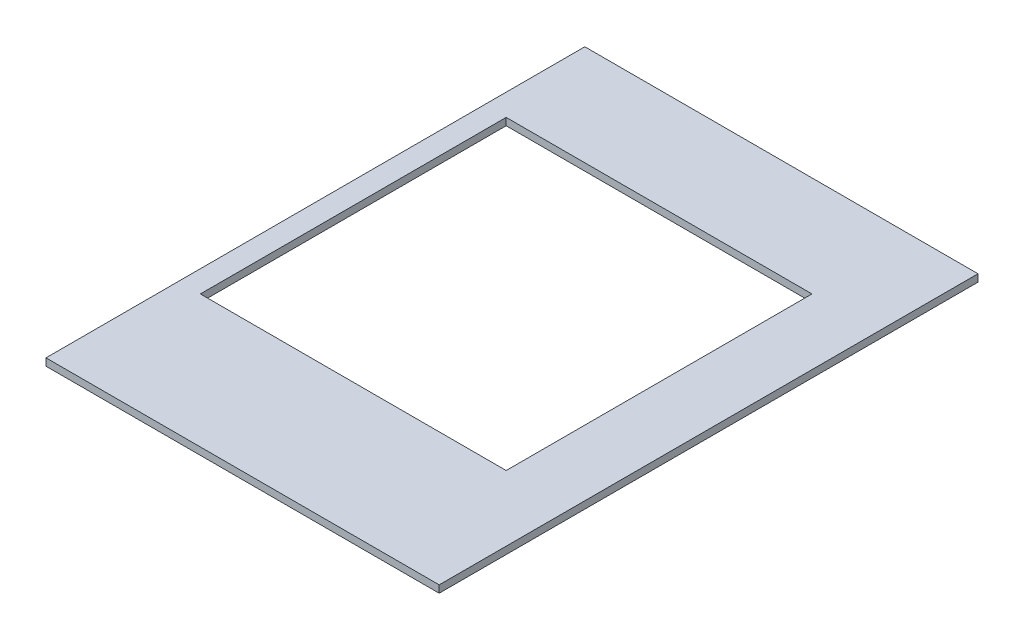
ISO-10303-21;
HEADER;
FILE_DESCRIPTION(('STEP AP214'),'2;1');
FILE_NAME('part.step','',(''),(''),'','','');
FILE_SCHEMA(('AUTOMOTIVE_DESIGN { 1 0 10303 214 1 1 1 1 }'));
ENDSEC;
DATA;
#1=APPLICATION_CONTEXT('core data for automotive mechanical design processes');
#2=APPLICATION_PROTOCOL_DEFINITION('international standard','automotive_design',2000,#1);
#3=PRODUCT_CONTEXT('',#1,'mechanical');
#4=PRODUCT('Part','Part','',(#3));
#5=PRODUCT_RELATED_PRODUCT_CATEGORY('part','',(#4));
#6=PRODUCT_DEFINITION_FORMATION('','',#4);
#7=PRODUCT_DEFINITION_CONTEXT('part definition',#1,'design');
#8=PRODUCT_DEFINITION('design','',#6,#7);
#9=PRODUCT_DEFINITION_SHAPE('','',#8);
#10=(LENGTH_UNIT() NAMED_UNIT(*) SI_UNIT(.MILLI.,.METRE.));
#11=(NAMED_UNIT(*) PLANE_ANGLE_UNIT() SI_UNIT($,.RADIAN.));
#12=(NAMED_UNIT(*) SI_UNIT($,.STERADIAN.) SOLID_ANGLE_UNIT());
#13=UNCERTAINTY_MEASURE_WITH_UNIT(LENGTH_MEASURE(1.E-05),#10,'distance_accuracy_value','');
#14=(GEOMETRIC_REPRESENTATION_CONTEXT(3) GLOBAL_UNCERTAINTY_ASSIGNED_CONTEXT((#13)) GLOBAL_UNIT_ASSIGNED_CONTEXT((#10,
#11,#12)) REPRESENTATION_CONTEXT('',''));
#15=CARTESIAN_POINT('',(0.,0.,0.));
#16=DIRECTION('',(0.,0.,1.));
#17=DIRECTION('',(1.,0.,0.));
#18=AXIS2_PLACEMENT_3D('',#15,#16,#17);
#19=CARTESIAN_POINT('',(0.,5.,0.));
#20=DIRECTION('',(0.,-1.,0.));
#21=DIRECTION('',(0.,0.,-1.));
#22=AXIS2_PLACEMENT_3D('',#19,#20,#21);
#23=PLANE('',#22);
#24=DIRECTION('',(0.,0.,1.));
#25=VECTOR('',#24,1.);
#26=CARTESIAN_POINT('',(0.,5.,0.));
#27=LINE('',#26,#25);
#28=CARTESIAN_POINT('',(0.,5.,-370.));
#29=VERTEX_POINT('',#28);
#30=CARTESIAN_POINT('',(0.,5.,0.));
#31=VERTEX_POINT('',#30);
#32=EDGE_CURVE('E134',#29,#31,#27,.T.);
#33=ORIENTED_EDGE('',*,*,#32,.T.);
#34=DIRECTION('',(1.,0.,0.));
#35=VECTOR('',#34,1.);
#36=CARTESIAN_POINT('',(0.,5.,0.));
#37=LINE('',#36,#35);
#38=CARTESIAN_POINT('',(270.,5.,0.));
#39=VERTEX_POINT('',#38);
#40=EDGE_CURVE('E137',#31,#39,#37,.T.);
#41=ORIENTED_EDGE('',*,*,#40,.T.);
#42=DIRECTION('',(0.,0.,-1.));
#43=VECTOR('',#42,1.);
#44=CARTESIAN_POINT('',(270.,5.,0.));
#45=LINE('',#44,#43);
#46=CARTESIAN_POINT('',(270.,5.,-370.));
#47=VERTEX_POINT('',#46);
#48=EDGE_CURVE('E140',#39,#47,#45,.T.);
#49=ORIENTED_EDGE('',*,*,#48,.T.);
#50=DIRECTION('',(-1.,0.,0.));
#51=VECTOR('',#50,1.);
#52=CARTESIAN_POINT('',(0.,5.,-370.));
#53=LINE('',#52,#51);
#54=EDGE_CURVE('E142',#47,#29,#53,.T.);
#55=ORIENTED_EDGE('',*,*,#54,.T.);
#56=EDGE_LOOP('',(#33,#41,#49,#55));
#57=FACE_BOUND('',#56,.T.);
#58=DIRECTION('',(0.,0.,1.));
#59=VECTOR('',#58,1.);
#60=CARTESIAN_POINT('',(15.,5.,-91.));
#61=LINE('',#60,#59);
#62=CARTESIAN_POINT('',(15.,5.,-301.));
#63=VERTEX_POINT('',#62);
#64=CARTESIAN_POINT('',(15.,5.,-91.));
#65=VERTEX_POINT('',#64);
#66=EDGE_CURVE('E98',#63,#65,#61,.T.);
#67=ORIENTED_EDGE('',*,*,#66,.F.);
#68=DIRECTION('',(-1.,0.,0.));
#69=VECTOR('',#68,1.);
#70=CARTESIAN_POINT('',(15.,5.,-301.));
#71=LINE('',#70,#69);
#72=CARTESIAN_POINT('',(225.,5.,-301.));
#73=VERTEX_POINT('',#72);
#74=EDGE_CURVE('E120',#73,#63,#71,.T.);
#75=ORIENTED_EDGE('',*,*,#74,.F.);
#76=DIRECTION('',(0.,0.,-1.));
#77=VECTOR('',#76,1.);
#78=CARTESIAN_POINT('',(225.,5.,-91.));
#79=LINE('',#78,#77);
#80=CARTESIAN_POINT('',(225.,5.,-91.));
#81=VERTEX_POINT('',#80);
#82=EDGE_CURVE('E118',#81,#73,#79,.T.);
#83=ORIENTED_EDGE('',*,*,#82,.F.);
#84=DIRECTION('',(1.,0.,0.));
#85=VECTOR('',#84,1.);
#86=CARTESIAN_POINT('',(15.,5.,-91.));
#87=LINE('',#86,#85);
#88=EDGE_CURVE('E106',#65,#81,#87,.T.);
#89=ORIENTED_EDGE('',*,*,#88,.F.);
#90=EDGE_LOOP('',(#67,#75,#83,#89));
#91=FACE_BOUND('',#90,.T.);
#92=ADVANCED_FACE('F33',(#57,#91),#23,.F.);
#93=CARTESIAN_POINT('',(0.,0.,0.));
#94=DIRECTION('',(0.,-1.,0.));
#95=DIRECTION('',(0.,0.,-1.));
#96=AXIS2_PLACEMENT_3D('',#93,#94,#95);
#97=PLANE('',#96);
#98=DIRECTION('',(0.,0.,1.));
#99=VECTOR('',#98,1.);
#100=CARTESIAN_POINT('',(0.,0.,0.));
#101=LINE('',#100,#99);
#102=CARTESIAN_POINT('',(0.,0.,-370.));
#103=VERTEX_POINT('',#102);
#104=CARTESIAN_POINT('',(0.,0.,0.));
#105=VERTEX_POINT('',#104);
#106=EDGE_CURVE('E114',#103,#105,#101,.T.);
#107=ORIENTED_EDGE('',*,*,#106,.F.);
#108=DIRECTION('',(-1.,0.,0.));
#109=VECTOR('',#108,1.);
#110=CARTESIAN_POINT('',(0.,0.,-370.));
#111=LINE('',#110,#109);
#112=CARTESIAN_POINT('',(270.,0.,-370.));
#113=VERTEX_POINT('',#112);
#114=EDGE_CURVE('E138',#113,#103,#111,.T.);
#115=ORIENTED_EDGE('',*,*,#114,.F.);
#116=DIRECTION('',(0.,0.,-1.));
#117=VECTOR('',#116,1.);
#118=CARTESIAN_POINT('',(270.,0.,0.));
#119=LINE('',#118,#117);
#120=CARTESIAN_POINT('',(270.,0.,0.));
#121=VERTEX_POINT('',#120);
#122=EDGE_CURVE('E149',#121,#113,#119,.T.);
#123=ORIENTED_EDGE('',*,*,#122,.F.);
#124=DIRECTION('',(1.,0.,0.));
#125=VECTOR('',#124,1.);
#126=CARTESIAN_POINT('',(0.,0.,0.));
#127=LINE('',#126,#125);
#128=EDGE_CURVE('E147',#105,#121,#127,.T.);
#129=ORIENTED_EDGE('',*,*,#128,.F.);
#130=EDGE_LOOP('',(#107,#115,#123,#129));
#131=FACE_BOUND('',#130,.T.);
#132=DIRECTION('',(-1.,0.,0.));
#133=VECTOR('',#132,1.);
#134=CARTESIAN_POINT('',(15.,0.,-301.));
#135=LINE('',#134,#133);
#136=CARTESIAN_POINT('',(225.,0.,-301.));
#137=VERTEX_POINT('',#136);
#138=CARTESIAN_POINT('',(15.,0.,-301.));
#139=VERTEX_POINT('',#138);
#140=EDGE_CURVE('E107',#137,#139,#135,.T.);
#141=ORIENTED_EDGE('',*,*,#140,.T.);
#142=DIRECTION('',(0.,0.,1.));
#143=VECTOR('',#142,1.);
#144=CARTESIAN_POINT('',(15.,0.,-91.));
#145=LINE('',#144,#143);
#146=CARTESIAN_POINT('',(15.,0.,-91.));
#147=VERTEX_POINT('',#146);
#148=EDGE_CURVE('E56',#139,#147,#145,.T.);
#149=ORIENTED_EDGE('',*,*,#148,.T.);
#150=DIRECTION('',(1.,0.,0.));
#151=VECTOR('',#150,1.);
#152=CARTESIAN_POINT('',(15.,0.,-91.));
#153=LINE('',#152,#151);
#154=CARTESIAN_POINT('',(225.,0.,-91.));
#155=VERTEX_POINT('',#154);
#156=EDGE_CURVE('E113',#147,#155,#153,.T.);
#157=ORIENTED_EDGE('',*,*,#156,.T.);
#158=DIRECTION('',(0.,0.,-1.));
#159=VECTOR('',#158,1.);
#160=CARTESIAN_POINT('',(225.,0.,-91.));
#161=LINE('',#160,#159);
#162=EDGE_CURVE('E126',#155,#137,#161,.T.);
#163=ORIENTED_EDGE('',*,*,#162,.T.);
#164=EDGE_LOOP('',(#141,#149,#157,#163));
#165=FACE_BOUND('',#164,.T.);
#166=ADVANCED_FACE('F167',(#131,#165),#97,.T.);
#167=CARTESIAN_POINT('',(0.,5.,0.));
#168=DIRECTION('',(1.,0.,0.));
#169=DIRECTION('',(0.,0.,-1.));
#170=AXIS2_PLACEMENT_3D('',#167,#168,#169);
#171=PLANE('',#170);
#172=ORIENTED_EDGE('',*,*,#106,.T.);
#173=DIRECTION('',(0.,-1.,0.));
#174=VECTOR('',#173,1.);
#175=CARTESIAN_POINT('',(0.,5.,0.));
#176=LINE('',#175,#174);
#177=EDGE_CURVE('E11',#31,#105,#176,.T.);
#178=ORIENTED_EDGE('',*,*,#177,.F.);
#179=ORIENTED_EDGE('',*,*,#32,.F.);
#180=DIRECTION('',(0.,-1.,0.));
#181=VECTOR('',#180,1.);
#182=CARTESIAN_POINT('',(0.,5.,-370.));
#183=LINE('',#182,#181);
#184=EDGE_CURVE('E144',#29,#103,#183,.T.);
#185=ORIENTED_EDGE('',*,*,#184,.T.);
#186=EDGE_LOOP('',(#172,#178,#179,#185));
#187=FACE_BOUND('',#186,.T.);
#188=ADVANCED_FACE('F35',(#187),#171,.F.);
#189=CARTESIAN_POINT('',(0.,5.,0.));
#190=DIRECTION('',(0.,0.,-1.));
#191=DIRECTION('',(-1.,0.,0.));
#192=AXIS2_PLACEMENT_3D('',#189,#190,#191);
#193=PLANE('',#192);
#194=ORIENTED_EDGE('',*,*,#128,.T.);
#195=DIRECTION('',(0.,-1.,0.));
#196=VECTOR('',#195,1.);
#197=CARTESIAN_POINT('',(270.,5.,0.));
#198=LINE('',#197,#196);
#199=EDGE_CURVE('E41',#39,#121,#198,.T.);
#200=ORIENTED_EDGE('',*,*,#199,.F.);
#201=ORIENTED_EDGE('',*,*,#40,.F.);
#202=ORIENTED_EDGE('',*,*,#177,.T.);
#203=EDGE_LOOP('',(#194,#200,#201,#202));
#204=FACE_BOUND('',#203,.T.);
#205=ADVANCED_FACE('F177',(#204),#193,.F.);
#206=CARTESIAN_POINT('',(270.,5.,0.));
#207=DIRECTION('',(-1.,0.,0.));
#208=DIRECTION('',(0.,0.,1.));
#209=AXIS2_PLACEMENT_3D('',#206,#207,#208);
#210=PLANE('',#209);
#211=ORIENTED_EDGE('',*,*,#122,.T.);
#212=DIRECTION('',(0.,-1.,0.));
#213=VECTOR('',#212,1.);
#214=CARTESIAN_POINT('',(270.,5.,-370.));
#215=LINE('',#214,#213);
#216=EDGE_CURVE('E154',#47,#113,#215,.T.);
#217=ORIENTED_EDGE('',*,*,#216,.F.);
#218=ORIENTED_EDGE('',*,*,#48,.F.);
#219=ORIENTED_EDGE('',*,*,#199,.T.);
#220=EDGE_LOOP('',(#211,#217,#218,#219));
#221=FACE_BOUND('',#220,.T.);
#222=ADVANCED_FACE('F161',(#221),#210,.F.);
#223=CARTESIAN_POINT('',(0.,5.,-370.));
#224=DIRECTION('',(0.,0.,1.));
#225=DIRECTION('',(1.,0.,0.));
#226=AXIS2_PLACEMENT_3D('',#223,#224,#225);
#227=PLANE('',#226);
#228=ORIENTED_EDGE('',*,*,#114,.T.);
#229=ORIENTED_EDGE('',*,*,#184,.F.);
#230=ORIENTED_EDGE('',*,*,#54,.F.);
#231=ORIENTED_EDGE('',*,*,#216,.T.);
#232=EDGE_LOOP('',(#228,#229,#230,#231));
#233=FACE_BOUND('',#232,.T.);
#234=ADVANCED_FACE('F171',(#233),#227,.F.);
#235=CARTESIAN_POINT('',(15.,5.,-91.));
#236=DIRECTION('',(1.,0.,0.));
#237=DIRECTION('',(0.,0.,-1.));
#238=AXIS2_PLACEMENT_3D('',#235,#236,#237);
#239=PLANE('',#238);
#240=ORIENTED_EDGE('',*,*,#148,.F.);
#241=DIRECTION('',(0.,-1.,0.));
#242=VECTOR('',#241,1.);
#243=CARTESIAN_POINT('',(15.,5.,-301.));
#244=LINE('',#243,#242);
#245=EDGE_CURVE('E102',#63,#139,#244,.T.);
#246=ORIENTED_EDGE('',*,*,#245,.F.);
#247=ORIENTED_EDGE('',*,*,#66,.T.);
#248=DIRECTION('',(0.,-1.,0.));
#249=VECTOR('',#248,1.);
#250=CARTESIAN_POINT('',(15.,5.,-91.));
#251=LINE('',#250,#249);
#252=EDGE_CURVE('E101',#65,#147,#251,.T.);
#253=ORIENTED_EDGE('',*,*,#252,.T.);
#254=EDGE_LOOP('',(#240,#246,#247,#253));
#255=FACE_BOUND('',#254,.T.);
#256=ADVANCED_FACE('F100',(#255),#239,.T.);
#257=CARTESIAN_POINT('',(15.,5.,-91.));
#258=DIRECTION('',(0.,0.,-1.));
#259=DIRECTION('',(-1.,0.,0.));
#260=AXIS2_PLACEMENT_3D('',#257,#258,#259);
#261=PLANE('',#260);
#262=ORIENTED_EDGE('',*,*,#156,.F.);
#263=ORIENTED_EDGE('',*,*,#252,.F.);
#264=ORIENTED_EDGE('',*,*,#88,.T.);
#265=DIRECTION('',(0.,-1.,0.));
#266=VECTOR('',#265,1.);
#267=CARTESIAN_POINT('',(225.,5.,-91.));
#268=LINE('',#267,#266);
#269=EDGE_CURVE('E115',#81,#155,#268,.T.);
#270=ORIENTED_EDGE('',*,*,#269,.T.);
#271=EDGE_LOOP('',(#262,#263,#264,#270));
#272=FACE_BOUND('',#271,.T.);
#273=ADVANCED_FACE('F110',(#272),#261,.T.);
#274=CARTESIAN_POINT('',(225.,5.,-91.));
#275=DIRECTION('',(-1.,0.,0.));
#276=DIRECTION('',(0.,0.,1.));
#277=AXIS2_PLACEMENT_3D('',#274,#275,#276);
#278=PLANE('',#277);
#279=ORIENTED_EDGE('',*,*,#162,.F.);
#280=ORIENTED_EDGE('',*,*,#269,.F.);
#281=ORIENTED_EDGE('',*,*,#82,.T.);
#282=DIRECTION('',(0.,-1.,0.));
#283=VECTOR('',#282,1.);
#284=CARTESIAN_POINT('',(225.,5.,-301.));
#285=LINE('',#284,#283);
#286=EDGE_CURVE('E48',#73,#137,#285,.T.);
#287=ORIENTED_EDGE('',*,*,#286,.T.);
#288=EDGE_LOOP('',(#279,#280,#281,#287));
#289=FACE_BOUND('',#288,.T.);
#290=ADVANCED_FACE('F200',(#289),#278,.T.);
#291=CARTESIAN_POINT('',(15.,5.,-301.));
#292=DIRECTION('',(0.,0.,1.));
#293=DIRECTION('',(1.,0.,0.));
#294=AXIS2_PLACEMENT_3D('',#291,#292,#293);
#295=PLANE('',#294);
#296=ORIENTED_EDGE('',*,*,#140,.F.);
#297=ORIENTED_EDGE('',*,*,#286,.F.);
#298=ORIENTED_EDGE('',*,*,#74,.T.);
#299=ORIENTED_EDGE('',*,*,#245,.T.);
#300=EDGE_LOOP('',(#296,#297,#298,#299));
#301=FACE_BOUND('',#300,.T.);
#302=ADVANCED_FACE('F204',(#301),#295,.T.);
#303=CLOSED_SHELL('',(#92,#166,#188,#205,#222,#234,#256,#273,#290,#302));
#304=MANIFOLD_SOLID_BREP('B2',#303);
#305=ADVANCED_BREP_SHAPE_REPRESENTATION('',(#18,#304),#14);
#306=SHAPE_DEFINITION_REPRESENTATION(#9,#305);
ENDSEC;
END-ISO-10303-21;
